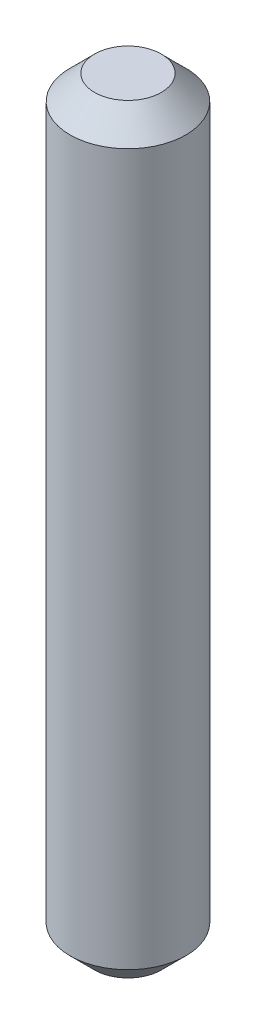
ISO-10303-21;
HEADER;
FILE_DESCRIPTION(('STEP AP214'),'2;1');
FILE_NAME('part.step','',(''),(''),'','','');
FILE_SCHEMA(('AUTOMOTIVE_DESIGN { 1 0 10303 214 1 1 1 1 }'));
ENDSEC;
DATA;
#1=APPLICATION_CONTEXT('core data for automotive mechanical design processes');
#2=APPLICATION_PROTOCOL_DEFINITION('international standard','automotive_design',2000,#1);
#3=PRODUCT_CONTEXT('',#1,'mechanical');
#4=PRODUCT('Part','Part','',(#3));
#5=PRODUCT_RELATED_PRODUCT_CATEGORY('part','',(#4));
#6=PRODUCT_DEFINITION_FORMATION('','',#4);
#7=PRODUCT_DEFINITION_CONTEXT('part definition',#1,'design');
#8=PRODUCT_DEFINITION('design','',#6,#7);
#9=PRODUCT_DEFINITION_SHAPE('','',#8);
#10=(LENGTH_UNIT() NAMED_UNIT(*) SI_UNIT(.MILLI.,.METRE.));
#11=(NAMED_UNIT(*) PLANE_ANGLE_UNIT() SI_UNIT($,.RADIAN.));
#12=(NAMED_UNIT(*) SI_UNIT($,.STERADIAN.) SOLID_ANGLE_UNIT());
#13=UNCERTAINTY_MEASURE_WITH_UNIT(LENGTH_MEASURE(1.E-05),#10,'distance_accuracy_value','');
#14=(GEOMETRIC_REPRESENTATION_CONTEXT(3) GLOBAL_UNCERTAINTY_ASSIGNED_CONTEXT((#13)) GLOBAL_UNIT_ASSIGNED_CONTEXT((#10,
#11,#12)) REPRESENTATION_CONTEXT('',''));
#15=CARTESIAN_POINT('',(0.,0.,0.));
#16=DIRECTION('',(0.,0.,1.));
#17=DIRECTION('',(1.,0.,0.));
#18=AXIS2_PLACEMENT_3D('',#15,#16,#17);
#19=CARTESIAN_POINT('',(0.,39.37,0.));
#20=DIRECTION('',(0.,-1.,0.));
#21=DIRECTION('',(0.,0.,-1.));
#22=AXIS2_PLACEMENT_3D('',#19,#20,#21);
#23=CYLINDRICAL_SURFACE('',#22,2.9972);
#24=CARTESIAN_POINT('',(0.,38.1,0.));
#25=DIRECTION('',(0.,1.,0.));
#26=DIRECTION('',(0.,0.,1.));
#27=AXIS2_PLACEMENT_3D('',#24,#25,#26);
#28=CIRCLE('',#27,2.9972);
#29=CARTESIAN_POINT('',(0.,38.1,2.9972));
#30=VERTEX_POINT('',#29);
#31=EDGE_CURVE('E53',#30,#30,#28,.F.);
#32=ORIENTED_EDGE('',*,*,#31,.T.);
#33=EDGE_LOOP('',(#32));
#34=FACE_BOUND('',#33,.T.);
#35=CARTESIAN_POINT('',(0.,1.26999999999999,0.));
#36=DIRECTION('',(0.,1.,0.));
#37=DIRECTION('',(0.,0.,1.));
#38=AXIS2_PLACEMENT_3D('',#35,#36,#37);
#39=CIRCLE('',#38,2.9972);
#40=CARTESIAN_POINT('',(0.,1.26999999999999,2.9972));
#41=VERTEX_POINT('',#40);
#42=EDGE_CURVE('E56',#41,#41,#39,.T.);
#43=ORIENTED_EDGE('',*,*,#42,.T.);
#44=EDGE_LOOP('',(#43));
#45=FACE_BOUND('',#44,.T.);
#46=ADVANCED_FACE('F44',(#34,#45),#23,.T.);
#47=CARTESIAN_POINT('',(0.,39.37,0.));
#48=DIRECTION('',(0.,1.,0.));
#49=DIRECTION('',(0.,0.,1.));
#50=AXIS2_PLACEMENT_3D('',#47,#48,#49);
#51=PLANE('',#50);
#52=CARTESIAN_POINT('',(0.,39.37,0.));
#53=DIRECTION('',(0.,1.,0.));
#54=DIRECTION('',(0.,0.,1.));
#55=AXIS2_PLACEMENT_3D('',#52,#53,#54);
#56=CIRCLE('',#55,1.7272);
#57=CARTESIAN_POINT('',(0.,39.37,1.7272));
#58=VERTEX_POINT('',#57);
#59=EDGE_CURVE('E65',#58,#58,#56,.T.);
#60=ORIENTED_EDGE('',*,*,#59,.T.);
#61=EDGE_LOOP('',(#60));
#62=FACE_BOUND('',#61,.T.);
#63=ADVANCED_FACE('F72',(#62),#51,.T.);
#64=CARTESIAN_POINT('',(0.,0.,0.));
#65=DIRECTION('',(0.,1.,0.));
#66=DIRECTION('',(0.,0.,1.));
#67=AXIS2_PLACEMENT_3D('',#64,#65,#66);
#68=PLANE('',#67);
#69=CARTESIAN_POINT('',(0.,0.,0.));
#70=DIRECTION('',(0.,1.,0.));
#71=DIRECTION('',(0.,0.,1.));
#72=AXIS2_PLACEMENT_3D('',#69,#70,#71);
#73=CIRCLE('',#72,1.7272);
#74=CARTESIAN_POINT('',(0.,0.,1.7272));
#75=VERTEX_POINT('',#74);
#76=EDGE_CURVE('E10',#75,#75,#73,.F.);
#77=ORIENTED_EDGE('',*,*,#76,.T.);
#78=EDGE_LOOP('',(#77));
#79=FACE_BOUND('',#78,.T.);
#80=ADVANCED_FACE('F73',(#79),#68,.F.);
#81=CARTESIAN_POINT('',(0.,39.37,0.));
#82=DIRECTION('',(0.,-1.,0.));
#83=DIRECTION('',(0.,0.,-1.));
#84=AXIS2_PLACEMENT_3D('',#81,#82,#83);
#85=CONICAL_SURFACE('',#84,1.7272,0.785398163397448);
#86=ORIENTED_EDGE('',*,*,#31,.F.);
#87=EDGE_LOOP('',(#86));
#88=FACE_BOUND('',#87,.T.);
#89=ORIENTED_EDGE('',*,*,#59,.F.);
#90=EDGE_LOOP('',(#89));
#91=FACE_BOUND('',#90,.T.);
#92=ADVANCED_FACE('F71',(#88,#91),#85,.T.);
#93=CARTESIAN_POINT('',(0.,1.26999999999999,0.));
#94=DIRECTION('',(0.,1.,0.));
#95=DIRECTION('',(0.,0.,1.));
#96=AXIS2_PLACEMENT_3D('',#93,#94,#95);
#97=CONICAL_SURFACE('',#96,2.9972,0.78539816339745);
#98=ORIENTED_EDGE('',*,*,#76,.F.);
#99=EDGE_LOOP('',(#98));
#100=FACE_BOUND('',#99,.T.);
#101=ORIENTED_EDGE('',*,*,#42,.F.);
#102=EDGE_LOOP('',(#101));
#103=FACE_BOUND('',#102,.T.);
#104=ADVANCED_FACE('F48',(#100,#103),#97,.T.);
#105=CLOSED_SHELL('',(#46,#63,#80,#92,#104));
#106=MANIFOLD_SOLID_BREP('B2',#105);
#107=ADVANCED_BREP_SHAPE_REPRESENTATION('',(#18,#106),#14);
#108=SHAPE_DEFINITION_REPRESENTATION(#9,#107);
ENDSEC;
END-ISO-10303-21;
